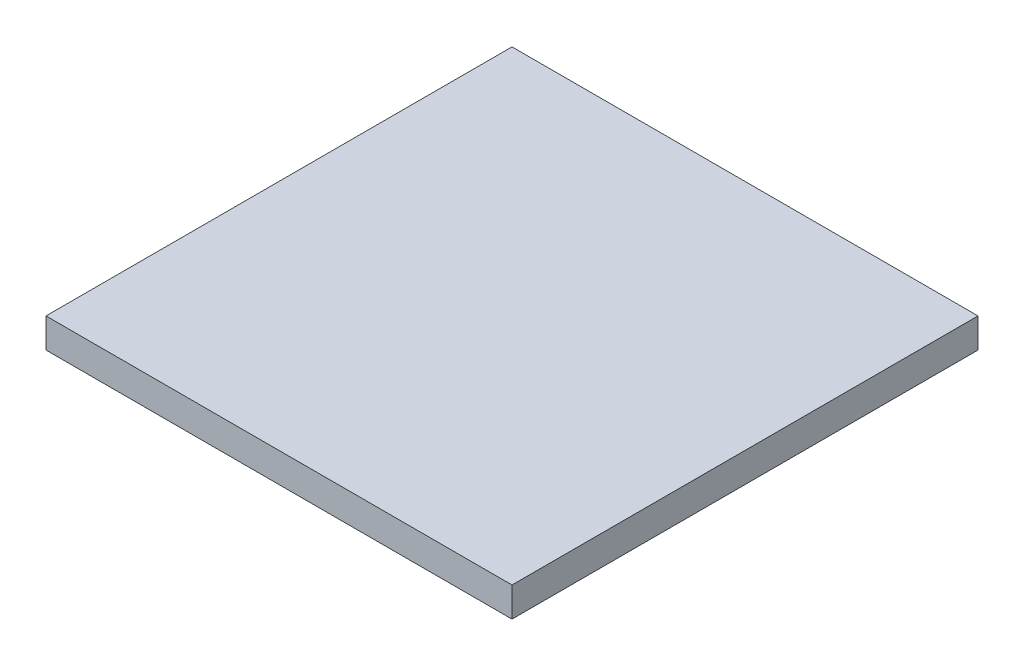
ISO-10303-21;
HEADER;
FILE_DESCRIPTION(('STEP AP214'),'2;1');
FILE_NAME('part.step','',(''),(''),'','','');
FILE_SCHEMA(('AUTOMOTIVE_DESIGN { 1 0 10303 214 1 1 1 1 }'));
ENDSEC;
DATA;
#1=APPLICATION_CONTEXT('core data for automotive mechanical design processes');
#2=APPLICATION_PROTOCOL_DEFINITION('international standard','automotive_design',2000,#1);
#3=PRODUCT_CONTEXT('',#1,'mechanical');
#4=PRODUCT('Part','Part','',(#3));
#5=PRODUCT_RELATED_PRODUCT_CATEGORY('part','',(#4));
#6=PRODUCT_DEFINITION_FORMATION('','',#4);
#7=PRODUCT_DEFINITION_CONTEXT('part definition',#1,'design');
#8=PRODUCT_DEFINITION('design','',#6,#7);
#9=PRODUCT_DEFINITION_SHAPE('','',#8);
#10=(LENGTH_UNIT() NAMED_UNIT(*) SI_UNIT(.MILLI.,.METRE.));
#11=(NAMED_UNIT(*) PLANE_ANGLE_UNIT() SI_UNIT($,.RADIAN.));
#12=(NAMED_UNIT(*) SI_UNIT($,.STERADIAN.) SOLID_ANGLE_UNIT());
#13=UNCERTAINTY_MEASURE_WITH_UNIT(LENGTH_MEASURE(1.E-05),#10,'distance_accuracy_value','');
#14=(GEOMETRIC_REPRESENTATION_CONTEXT(3) GLOBAL_UNCERTAINTY_ASSIGNED_CONTEXT((#13)) GLOBAL_UNIT_ASSIGNED_CONTEXT((#10,
#11,#12)) REPRESENTATION_CONTEXT('',''));
#15=CARTESIAN_POINT('',(0.,0.,0.));
#16=DIRECTION('',(0.,0.,1.));
#17=DIRECTION('',(1.,0.,0.));
#18=AXIS2_PLACEMENT_3D('',#15,#16,#17);
#19=CARTESIAN_POINT('',(0.,19.05,0.));
#20=DIRECTION('',(1.,0.,0.));
#21=DIRECTION('',(0.,0.,-1.));
#22=AXIS2_PLACEMENT_3D('',#19,#20,#21);
#23=PLANE('',#22);
#24=DIRECTION('',(0.,0.,1.));
#25=VECTOR('',#24,1.);
#26=CARTESIAN_POINT('',(0.,0.,0.));
#27=LINE('',#26,#25);
#28=CARTESIAN_POINT('',(0.,0.,-300.));
#29=VERTEX_POINT('',#28);
#30=CARTESIAN_POINT('',(0.,0.,0.));
#31=VERTEX_POINT('',#30);
#32=EDGE_CURVE('E94',#29,#31,#27,.T.);
#33=ORIENTED_EDGE('',*,*,#32,.T.);
#34=DIRECTION('',(0.,-1.,0.));
#35=VECTOR('',#34,1.);
#36=CARTESIAN_POINT('',(0.,19.05,0.));
#37=LINE('',#36,#35);
#38=CARTESIAN_POINT('',(0.,19.05,0.));
#39=VERTEX_POINT('',#38);
#40=EDGE_CURVE('E11',#39,#31,#37,.T.);
#41=ORIENTED_EDGE('',*,*,#40,.F.);
#42=DIRECTION('',(0.,0.,1.));
#43=VECTOR('',#42,1.);
#44=CARTESIAN_POINT('',(0.,19.05,0.));
#45=LINE('',#44,#43);
#46=CARTESIAN_POINT('',(0.,19.05,-300.));
#47=VERTEX_POINT('',#46);
#48=EDGE_CURVE('E82',#47,#39,#45,.T.);
#49=ORIENTED_EDGE('',*,*,#48,.F.);
#50=DIRECTION('',(0.,-1.,0.));
#51=VECTOR('',#50,1.);
#52=CARTESIAN_POINT('',(0.,19.05,-300.));
#53=LINE('',#52,#51);
#54=EDGE_CURVE('E90',#47,#29,#53,.T.);
#55=ORIENTED_EDGE('',*,*,#54,.T.);
#56=EDGE_LOOP('',(#33,#41,#49,#55));
#57=FACE_BOUND('',#56,.T.);
#58=ADVANCED_FACE('F31',(#57),#23,.F.);
#59=CARTESIAN_POINT('',(0.,19.05,0.));
#60=DIRECTION('',(0.,0.,-1.));
#61=DIRECTION('',(-1.,0.,0.));
#62=AXIS2_PLACEMENT_3D('',#59,#60,#61);
#63=PLANE('',#62);
#64=DIRECTION('',(1.,0.,0.));
#65=VECTOR('',#64,1.);
#66=CARTESIAN_POINT('',(0.,0.,0.));
#67=LINE('',#66,#65);
#68=CARTESIAN_POINT('',(300.,0.,0.));
#69=VERTEX_POINT('',#68);
#70=EDGE_CURVE('E86',#31,#69,#67,.T.);
#71=ORIENTED_EDGE('',*,*,#70,.T.);
#72=DIRECTION('',(0.,-1.,0.));
#73=VECTOR('',#72,1.);
#74=CARTESIAN_POINT('',(300.,19.05,0.));
#75=LINE('',#74,#73);
#76=CARTESIAN_POINT('',(300.,19.05,0.));
#77=VERTEX_POINT('',#76);
#78=EDGE_CURVE('E39',#77,#69,#75,.T.);
#79=ORIENTED_EDGE('',*,*,#78,.F.);
#80=DIRECTION('',(1.,0.,0.));
#81=VECTOR('',#80,1.);
#82=CARTESIAN_POINT('',(0.,19.05,0.));
#83=LINE('',#82,#81);
#84=EDGE_CURVE('E77',#39,#77,#83,.T.);
#85=ORIENTED_EDGE('',*,*,#84,.F.);
#86=ORIENTED_EDGE('',*,*,#40,.T.);
#87=EDGE_LOOP('',(#71,#79,#85,#86));
#88=FACE_BOUND('',#87,.T.);
#89=ADVANCED_FACE('F85',(#88),#63,.F.);
#90=CARTESIAN_POINT('',(300.,19.05,0.));
#91=DIRECTION('',(-1.,0.,0.));
#92=DIRECTION('',(0.,0.,1.));
#93=AXIS2_PLACEMENT_3D('',#90,#91,#92);
#94=PLANE('',#93);
#95=DIRECTION('',(0.,0.,-1.));
#96=VECTOR('',#95,1.);
#97=CARTESIAN_POINT('',(300.,0.,0.));
#98=LINE('',#97,#96);
#99=CARTESIAN_POINT('',(300.,0.,-300.));
#100=VERTEX_POINT('',#99);
#101=EDGE_CURVE('E64',#69,#100,#98,.T.);
#102=ORIENTED_EDGE('',*,*,#101,.T.);
#103=DIRECTION('',(0.,-1.,0.));
#104=VECTOR('',#103,1.);
#105=CARTESIAN_POINT('',(300.,19.05,-300.));
#106=LINE('',#105,#104);
#107=CARTESIAN_POINT('',(300.,19.05,-300.));
#108=VERTEX_POINT('',#107);
#109=EDGE_CURVE('E87',#108,#100,#106,.T.);
#110=ORIENTED_EDGE('',*,*,#109,.F.);
#111=DIRECTION('',(0.,0.,-1.));
#112=VECTOR('',#111,1.);
#113=CARTESIAN_POINT('',(300.,19.05,0.));
#114=LINE('',#113,#112);
#115=EDGE_CURVE('E80',#77,#108,#114,.T.);
#116=ORIENTED_EDGE('',*,*,#115,.F.);
#117=ORIENTED_EDGE('',*,*,#78,.T.);
#118=EDGE_LOOP('',(#102,#110,#116,#117));
#119=FACE_BOUND('',#118,.T.);
#120=ADVANCED_FACE('F88',(#119),#94,.F.);
#121=CARTESIAN_POINT('',(0.,19.05,-300.));
#122=DIRECTION('',(0.,0.,1.));
#123=DIRECTION('',(1.,0.,0.));
#124=AXIS2_PLACEMENT_3D('',#121,#122,#123);
#125=PLANE('',#124);
#126=DIRECTION('',(-1.,0.,0.));
#127=VECTOR('',#126,1.);
#128=CARTESIAN_POINT('',(0.,0.,-300.));
#129=LINE('',#128,#127);
#130=EDGE_CURVE('E70',#100,#29,#129,.T.);
#131=ORIENTED_EDGE('',*,*,#130,.T.);
#132=ORIENTED_EDGE('',*,*,#54,.F.);
#133=DIRECTION('',(-1.,0.,0.));
#134=VECTOR('',#133,1.);
#135=CARTESIAN_POINT('',(0.,19.05,-300.));
#136=LINE('',#135,#134);
#137=EDGE_CURVE('E47',#108,#47,#136,.T.);
#138=ORIENTED_EDGE('',*,*,#137,.F.);
#139=ORIENTED_EDGE('',*,*,#109,.T.);
#140=EDGE_LOOP('',(#131,#132,#138,#139));
#141=FACE_BOUND('',#140,.T.);
#142=ADVANCED_FACE('F101',(#141),#125,.F.);
#143=CARTESIAN_POINT('',(0.,19.05,-300.));
#144=DIRECTION('',(0.,-1.,0.));
#145=DIRECTION('',(0.,0.,-1.));
#146=AXIS2_PLACEMENT_3D('',#143,#144,#145);
#147=PLANE('',#146);
#148=ORIENTED_EDGE('',*,*,#48,.T.);
#149=ORIENTED_EDGE('',*,*,#84,.T.);
#150=ORIENTED_EDGE('',*,*,#115,.T.);
#151=ORIENTED_EDGE('',*,*,#137,.T.);
#152=EDGE_LOOP('',(#148,#149,#150,#151));
#153=FACE_BOUND('',#152,.T.);
#154=ADVANCED_FACE('F78',(#153),#147,.F.);
#155=CARTESIAN_POINT('',(0.,0.,-300.));
#156=DIRECTION('',(0.,-1.,0.));
#157=DIRECTION('',(0.,0.,-1.));
#158=AXIS2_PLACEMENT_3D('',#155,#156,#157);
#159=PLANE('',#158);
#160=ORIENTED_EDGE('',*,*,#32,.F.);
#161=ORIENTED_EDGE('',*,*,#130,.F.);
#162=ORIENTED_EDGE('',*,*,#101,.F.);
#163=ORIENTED_EDGE('',*,*,#70,.F.);
#164=EDGE_LOOP('',(#160,#161,#162,#163));
#165=FACE_BOUND('',#164,.T.);
#166=ADVANCED_FACE('F104',(#165),#159,.T.);
#167=CLOSED_SHELL('',(#58,#89,#120,#142,#154,#166));
#168=MANIFOLD_SOLID_BREP('B2',#167);
#169=ADVANCED_BREP_SHAPE_REPRESENTATION('',(#18,#168),#14);
#170=SHAPE_DEFINITION_REPRESENTATION(#9,#169);
ENDSEC;
END-ISO-10303-21;
